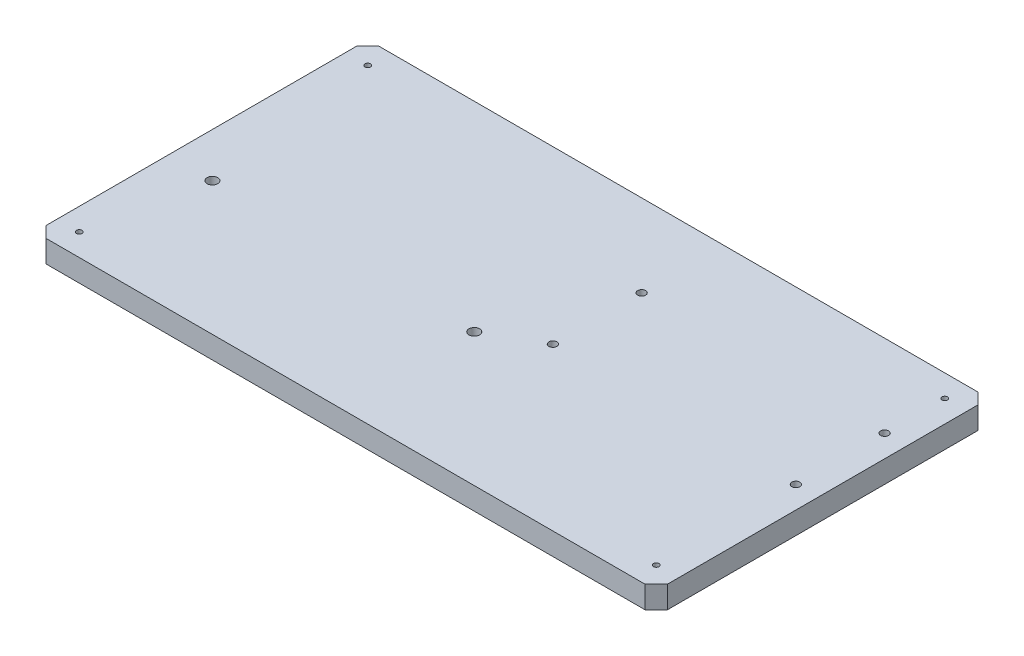
ISO-10303-21;
HEADER;
FILE_DESCRIPTION(('STEP AP214'),'2;1');
FILE_NAME('part.step','',(''),(''),'','','');
FILE_SCHEMA(('AUTOMOTIVE_DESIGN { 1 0 10303 214 1 1 1 1 }'));
ENDSEC;
DATA;
#1=APPLICATION_CONTEXT('core data for automotive mechanical design processes');
#2=APPLICATION_PROTOCOL_DEFINITION('international standard','automotive_design',2000,#1);
#3=PRODUCT_CONTEXT('',#1,'mechanical');
#4=PRODUCT('Part','Part','',(#3));
#5=PRODUCT_RELATED_PRODUCT_CATEGORY('part','',(#4));
#6=PRODUCT_DEFINITION_FORMATION('','',#4);
#7=PRODUCT_DEFINITION_CONTEXT('part definition',#1,'design');
#8=PRODUCT_DEFINITION('design','',#6,#7);
#9=PRODUCT_DEFINITION_SHAPE('','',#8);
#10=(LENGTH_UNIT() NAMED_UNIT(*) SI_UNIT(.MILLI.,.METRE.));
#11=(NAMED_UNIT(*) PLANE_ANGLE_UNIT() SI_UNIT($,.RADIAN.));
#12=(NAMED_UNIT(*) SI_UNIT($,.STERADIAN.) SOLID_ANGLE_UNIT());
#13=UNCERTAINTY_MEASURE_WITH_UNIT(LENGTH_MEASURE(1.E-05),#10,'distance_accuracy_value','');
#14=(GEOMETRIC_REPRESENTATION_CONTEXT(3) GLOBAL_UNCERTAINTY_ASSIGNED_CONTEXT((#13)) GLOBAL_UNIT_ASSIGNED_CONTEXT((#10,
#11,#12)) REPRESENTATION_CONTEXT('',''));
#15=CARTESIAN_POINT('',(0.,0.,0.));
#16=DIRECTION('',(0.,0.,1.));
#17=DIRECTION('',(1.,0.,0.));
#18=AXIS2_PLACEMENT_3D('',#15,#16,#17);
#19=CARTESIAN_POINT('',(0.,-10.,-5.));
#20=DIRECTION('',(-1.,0.,0.));
#21=DIRECTION('',(0.,0.,1.));
#22=AXIS2_PLACEMENT_3D('',#19,#20,#21);
#23=PLANE('',#22);
#24=DIRECTION('',(0.,0.,1.));
#25=VECTOR('',#24,1.);
#26=CARTESIAN_POINT('',(0.,0.,-5.));
#27=LINE('',#26,#25);
#28=CARTESIAN_POINT('',(0.,0.,-145.));
#29=VERTEX_POINT('',#28);
#30=CARTESIAN_POINT('',(0.,0.,-5.));
#31=VERTEX_POINT('',#30);
#32=EDGE_CURVE('E134',#29,#31,#27,.T.);
#33=ORIENTED_EDGE('',*,*,#32,.F.);
#34=DIRECTION('',(0.,1.,0.));
#35=VECTOR('',#34,1.);
#36=CARTESIAN_POINT('',(0.,-10.,-145.));
#37=LINE('',#36,#35);
#38=CARTESIAN_POINT('',(0.,-10.,-145.));
#39=VERTEX_POINT('',#38);
#40=EDGE_CURVE('E11',#39,#29,#37,.T.);
#41=ORIENTED_EDGE('',*,*,#40,.F.);
#42=DIRECTION('',(0.,0.,1.));
#43=VECTOR('',#42,1.);
#44=CARTESIAN_POINT('',(0.,-10.,-5.));
#45=LINE('',#44,#43);
#46=CARTESIAN_POINT('',(0.,-10.,-5.));
#47=VERTEX_POINT('',#46);
#48=EDGE_CURVE('E155',#39,#47,#45,.T.);
#49=ORIENTED_EDGE('',*,*,#48,.T.);
#50=DIRECTION('',(0.,1.,0.));
#51=VECTOR('',#50,1.);
#52=CARTESIAN_POINT('',(0.,-10.,-5.));
#53=LINE('',#52,#51);
#54=EDGE_CURVE('E40',#47,#31,#53,.T.);
#55=ORIENTED_EDGE('',*,*,#54,.T.);
#56=EDGE_LOOP('',(#33,#41,#49,#55));
#57=FACE_BOUND('',#56,.T.);
#58=ADVANCED_FACE('F37',(#57),#23,.T.);
#59=CARTESIAN_POINT('',(0.,-10.,-145.));
#60=DIRECTION('',(-0.707106781186548,0.,-0.707106781186547));
#61=DIRECTION('',(-0.707106781186547,0.,0.707106781186548));
#62=AXIS2_PLACEMENT_3D('',#59,#60,#61);
#63=PLANE('',#62);
#64=DIRECTION('',(-0.707106781186547,0.,0.707106781186548));
#65=VECTOR('',#64,1.);
#66=CARTESIAN_POINT('',(0.,0.,-145.));
#67=LINE('',#66,#65);
#68=CARTESIAN_POINT('',(5.,0.,-150.));
#69=VERTEX_POINT('',#68);
#70=EDGE_CURVE('E153',#69,#29,#67,.T.);
#71=ORIENTED_EDGE('',*,*,#70,.F.);
#72=DIRECTION('',(0.,1.,0.));
#73=VECTOR('',#72,1.);
#74=CARTESIAN_POINT('',(5.,-10.,-150.));
#75=LINE('',#74,#73);
#76=CARTESIAN_POINT('',(5.,-10.,-150.));
#77=VERTEX_POINT('',#76);
#78=EDGE_CURVE('E46',#77,#69,#75,.T.);
#79=ORIENTED_EDGE('',*,*,#78,.F.);
#80=DIRECTION('',(-0.707106781186547,0.,0.707106781186548));
#81=VECTOR('',#80,1.);
#82=CARTESIAN_POINT('',(0.,-10.,-145.));
#83=LINE('',#82,#81);
#84=EDGE_CURVE('E124',#77,#39,#83,.T.);
#85=ORIENTED_EDGE('',*,*,#84,.T.);
#86=ORIENTED_EDGE('',*,*,#40,.T.);
#87=EDGE_LOOP('',(#71,#79,#85,#86));
#88=FACE_BOUND('',#87,.T.);
#89=ADVANCED_FACE('F167',(#88),#63,.T.);
#90=CARTESIAN_POINT('',(5.,-10.,-150.));
#91=DIRECTION('',(0.,0.,-1.));
#92=DIRECTION('',(-1.,0.,0.));
#93=AXIS2_PLACEMENT_3D('',#90,#91,#92);
#94=PLANE('',#93);
#95=DIRECTION('',(-1.,0.,0.));
#96=VECTOR('',#95,1.);
#97=CARTESIAN_POINT('',(5.,0.,-150.));
#98=LINE('',#97,#96);
#99=CARTESIAN_POINT('',(275.,0.,-150.));
#100=VERTEX_POINT('',#99);
#101=EDGE_CURVE('E111',#100,#69,#98,.T.);
#102=ORIENTED_EDGE('',*,*,#101,.F.);
#103=DIRECTION('',(0.,1.,0.));
#104=VECTOR('',#103,1.);
#105=CARTESIAN_POINT('',(275.,-10.,-150.));
#106=LINE('',#105,#104);
#107=CARTESIAN_POINT('',(275.,-10.,-150.));
#108=VERTEX_POINT('',#107);
#109=EDGE_CURVE('E106',#108,#100,#106,.T.);
#110=ORIENTED_EDGE('',*,*,#109,.F.);
#111=DIRECTION('',(-1.,0.,0.));
#112=VECTOR('',#111,1.);
#113=CARTESIAN_POINT('',(5.,-10.,-150.));
#114=LINE('',#113,#112);
#115=EDGE_CURVE('E109',#108,#77,#114,.T.);
#116=ORIENTED_EDGE('',*,*,#115,.T.);
#117=ORIENTED_EDGE('',*,*,#78,.T.);
#118=EDGE_LOOP('',(#102,#110,#116,#117));
#119=FACE_BOUND('',#118,.T.);
#120=ADVANCED_FACE('F108',(#119),#94,.T.);
#121=CARTESIAN_POINT('',(275.,-10.,-150.));
#122=DIRECTION('',(0.707106781186548,0.,-0.707106781186548));
#123=DIRECTION('',(-0.707106781186548,0.,-0.707106781186548));
#124=AXIS2_PLACEMENT_3D('',#121,#122,#123);
#125=PLANE('',#124);
#126=DIRECTION('',(-0.707106781186547,0.,-0.707106781186547));
#127=VECTOR('',#126,1.);
#128=CARTESIAN_POINT('',(275.,0.,-150.));
#129=LINE('',#128,#127);
#130=CARTESIAN_POINT('',(280.,0.,-145.));
#131=VERTEX_POINT('',#130);
#132=EDGE_CURVE('E150',#131,#100,#129,.T.);
#133=ORIENTED_EDGE('',*,*,#132,.F.);
#134=DIRECTION('',(0.,1.,0.));
#135=VECTOR('',#134,1.);
#136=CARTESIAN_POINT('',(280.,-10.,-145.));
#137=LINE('',#136,#135);
#138=CARTESIAN_POINT('',(280.,-10.,-145.));
#139=VERTEX_POINT('',#138);
#140=EDGE_CURVE('E116',#139,#131,#137,.T.);
#141=ORIENTED_EDGE('',*,*,#140,.F.);
#142=DIRECTION('',(-0.707106781186547,0.,-0.707106781186547));
#143=VECTOR('',#142,1.);
#144=CARTESIAN_POINT('',(275.,-10.,-150.));
#145=LINE('',#144,#143);
#146=EDGE_CURVE('E122',#139,#108,#145,.T.);
#147=ORIENTED_EDGE('',*,*,#146,.T.);
#148=ORIENTED_EDGE('',*,*,#109,.T.);
#149=EDGE_LOOP('',(#133,#141,#147,#148));
#150=FACE_BOUND('',#149,.T.);
#151=ADVANCED_FACE('F126',(#150),#125,.T.);
#152=CARTESIAN_POINT('',(280.,-10.,-5.));
#153=DIRECTION('',(1.,0.,0.));
#154=DIRECTION('',(0.,0.,-1.));
#155=AXIS2_PLACEMENT_3D('',#152,#153,#154);
#156=PLANE('',#155);
#157=DIRECTION('',(0.,0.,-1.));
#158=VECTOR('',#157,1.);
#159=CARTESIAN_POINT('',(280.,0.,-5.));
#160=LINE('',#159,#158);
#161=CARTESIAN_POINT('',(280.,0.,-5.));
#162=VERTEX_POINT('',#161);
#163=EDGE_CURVE('E147',#162,#131,#160,.T.);
#164=ORIENTED_EDGE('',*,*,#163,.F.);
#165=DIRECTION('',(0.,1.,0.));
#166=VECTOR('',#165,1.);
#167=CARTESIAN_POINT('',(280.,-10.,-5.));
#168=LINE('',#167,#166);
#169=CARTESIAN_POINT('',(280.,-10.,-5.));
#170=VERTEX_POINT('',#169);
#171=EDGE_CURVE('E159',#170,#162,#168,.T.);
#172=ORIENTED_EDGE('',*,*,#171,.F.);
#173=DIRECTION('',(0.,0.,-1.));
#174=VECTOR('',#173,1.);
#175=CARTESIAN_POINT('',(280.,-10.,-5.));
#176=LINE('',#175,#174);
#177=EDGE_CURVE('E127',#170,#139,#176,.T.);
#178=ORIENTED_EDGE('',*,*,#177,.T.);
#179=ORIENTED_EDGE('',*,*,#140,.T.);
#180=EDGE_LOOP('',(#164,#172,#178,#179));
#181=FACE_BOUND('',#180,.T.);
#182=ADVANCED_FACE('F180',(#181),#156,.T.);
#183=CARTESIAN_POINT('',(275.,-10.,0.));
#184=DIRECTION('',(0.707106781186547,0.,0.707106781186548));
#185=DIRECTION('',(0.707106781186548,0.,-0.707106781186547));
#186=AXIS2_PLACEMENT_3D('',#183,#184,#185);
#187=PLANE('',#186);
#188=DIRECTION('',(0.707106781186548,0.,-0.707106781186547));
#189=VECTOR('',#188,1.);
#190=CARTESIAN_POINT('',(275.,0.,0.));
#191=LINE('',#190,#189);
#192=CARTESIAN_POINT('',(275.,0.,0.));
#193=VERTEX_POINT('',#192);
#194=EDGE_CURVE('E144',#193,#162,#191,.T.);
#195=ORIENTED_EDGE('',*,*,#194,.F.);
#196=DIRECTION('',(0.,1.,0.));
#197=VECTOR('',#196,1.);
#198=CARTESIAN_POINT('',(275.,-10.,0.));
#199=LINE('',#198,#197);
#200=CARTESIAN_POINT('',(275.,-10.,0.));
#201=VERTEX_POINT('',#200);
#202=EDGE_CURVE('E161',#201,#193,#199,.T.);
#203=ORIENTED_EDGE('',*,*,#202,.F.);
#204=DIRECTION('',(0.707106781186548,0.,-0.707106781186547));
#205=VECTOR('',#204,1.);
#206=CARTESIAN_POINT('',(275.,-10.,0.));
#207=LINE('',#206,#205);
#208=EDGE_CURVE('E129',#201,#170,#207,.T.);
#209=ORIENTED_EDGE('',*,*,#208,.T.);
#210=ORIENTED_EDGE('',*,*,#171,.T.);
#211=EDGE_LOOP('',(#195,#203,#209,#210));
#212=FACE_BOUND('',#211,.T.);
#213=ADVANCED_FACE('F183',(#212),#187,.T.);
#214=CARTESIAN_POINT('',(5.,-10.,0.));
#215=DIRECTION('',(0.,0.,1.));
#216=DIRECTION('',(1.,0.,0.));
#217=AXIS2_PLACEMENT_3D('',#214,#215,#216);
#218=PLANE('',#217);
#219=DIRECTION('',(1.,0.,0.));
#220=VECTOR('',#219,1.);
#221=CARTESIAN_POINT('',(5.,0.,0.));
#222=LINE('',#221,#220);
#223=CARTESIAN_POINT('',(5.,0.,0.));
#224=VERTEX_POINT('',#223);
#225=EDGE_CURVE('E141',#224,#193,#222,.T.);
#226=ORIENTED_EDGE('',*,*,#225,.F.);
#227=DIRECTION('',(0.,1.,0.));
#228=VECTOR('',#227,1.);
#229=CARTESIAN_POINT('',(5.,-10.,0.));
#230=LINE('',#229,#228);
#231=CARTESIAN_POINT('',(5.,-10.,0.));
#232=VERTEX_POINT('',#231);
#233=EDGE_CURVE('E162',#232,#224,#230,.T.);
#234=ORIENTED_EDGE('',*,*,#233,.F.);
#235=DIRECTION('',(1.,0.,0.));
#236=VECTOR('',#235,1.);
#237=CARTESIAN_POINT('',(5.,-10.,0.));
#238=LINE('',#237,#236);
#239=EDGE_CURVE('E393',#232,#201,#238,.T.);
#240=ORIENTED_EDGE('',*,*,#239,.T.);
#241=ORIENTED_EDGE('',*,*,#202,.T.);
#242=EDGE_LOOP('',(#226,#234,#240,#241));
#243=FACE_BOUND('',#242,.T.);
#244=ADVANCED_FACE('F187',(#243),#218,.T.);
#245=CARTESIAN_POINT('',(0.,-10.,-5.));
#246=DIRECTION('',(-0.707106781186548,0.,0.707106781186548));
#247=DIRECTION('',(0.707106781186548,0.,0.707106781186548));
#248=AXIS2_PLACEMENT_3D('',#245,#246,#247);
#249=PLANE('',#248);
#250=DIRECTION('',(0.707106781186548,0.,0.707106781186548));
#251=VECTOR('',#250,1.);
#252=CARTESIAN_POINT('',(0.,0.,-5.));
#253=LINE('',#252,#251);
#254=EDGE_CURVE('E137',#31,#224,#253,.T.);
#255=ORIENTED_EDGE('',*,*,#254,.F.);
#256=ORIENTED_EDGE('',*,*,#54,.F.);
#257=DIRECTION('',(0.707106781186548,0.,0.707106781186548));
#258=VECTOR('',#257,1.);
#259=CARTESIAN_POINT('',(0.,-10.,-5.));
#260=LINE('',#259,#258);
#261=EDGE_CURVE('E391',#47,#232,#260,.T.);
#262=ORIENTED_EDGE('',*,*,#261,.T.);
#263=ORIENTED_EDGE('',*,*,#233,.T.);
#264=EDGE_LOOP('',(#255,#256,#262,#263));
#265=FACE_BOUND('',#264,.T.);
#266=ADVANCED_FACE('F164',(#265),#249,.T.);
#267=CARTESIAN_POINT('',(0.,-10.,0.));
#268=DIRECTION('',(0.,-1.,0.));
#269=DIRECTION('',(0.,0.,-1.));
#270=AXIS2_PLACEMENT_3D('',#267,#268,#269);
#271=PLANE('',#270);
#272=CARTESIAN_POINT('',(160.5,-10.,-112.922675535204));
#273=DIRECTION('',(0.,-1.,0.));
#274=DIRECTION('',(0.,0.,-1.));
#275=AXIS2_PLACEMENT_3D('',#272,#273,#274);
#276=CIRCLE('',#275,3.5);
#277=CARTESIAN_POINT('',(160.5,-10.,-116.422675535204));
#278=VERTEX_POINT('',#277);
#279=EDGE_CURVE('E297',#278,#278,#276,.T.);
#280=ORIENTED_EDGE('',*,*,#279,.F.);
#281=EDGE_LOOP('',(#280));
#282=FACE_BOUND('',#281,.T.);
#283=CARTESIAN_POINT('',(160.5,-10.,-72.9226755352042));
#284=DIRECTION('',(0.,-1.,0.));
#285=DIRECTION('',(0.,0.,-1.));
#286=AXIS2_PLACEMENT_3D('',#283,#284,#285);
#287=CIRCLE('',#286,3.5);
#288=CARTESIAN_POINT('',(160.5,-10.,-76.4226755352042));
#289=VERTEX_POINT('',#288);
#290=EDGE_CURVE('E307',#289,#289,#287,.T.);
#291=ORIENTED_EDGE('',*,*,#290,.F.);
#292=EDGE_LOOP('',(#291));
#293=FACE_BOUND('',#292,.T.);
#294=CARTESIAN_POINT('',(270.,-10.,-112.922675535204));
#295=DIRECTION('',(0.,-1.,0.));
#296=DIRECTION('',(0.,0.,-1.));
#297=AXIS2_PLACEMENT_3D('',#294,#295,#296);
#298=CIRCLE('',#297,3.5);
#299=CARTESIAN_POINT('',(270.,-10.,-116.422675535204));
#300=VERTEX_POINT('',#299);
#301=EDGE_CURVE('E319',#300,#300,#298,.T.);
#302=ORIENTED_EDGE('',*,*,#301,.F.);
#303=EDGE_LOOP('',(#302));
#304=FACE_BOUND('',#303,.T.);
#305=CARTESIAN_POINT('',(270.,-10.,-72.9226755352042));
#306=DIRECTION('',(0.,-1.,0.));
#307=DIRECTION('',(0.,0.,-1.));
#308=AXIS2_PLACEMENT_3D('',#305,#306,#307);
#309=CIRCLE('',#308,3.5);
#310=CARTESIAN_POINT('',(270.,-10.,-76.4226755352042));
#311=VERTEX_POINT('',#310);
#312=EDGE_CURVE('E331',#311,#311,#309,.T.);
#313=ORIENTED_EDGE('',*,*,#312,.F.);
#314=EDGE_LOOP('',(#313));
#315=FACE_BOUND('',#314,.T.);
#316=CARTESIAN_POINT('',(10.,-10.,-10.));
#317=DIRECTION('',(0.,-1.,0.));
#318=DIRECTION('',(0.,0.,-1.));
#319=AXIS2_PLACEMENT_3D('',#316,#317,#318);
#320=CIRCLE('',#319,1.25);
#321=CARTESIAN_POINT('',(10.,-10.,-11.25));
#322=VERTEX_POINT('',#321);
#323=EDGE_CURVE('E343',#322,#322,#320,.T.);
#324=ORIENTED_EDGE('',*,*,#323,.F.);
#325=EDGE_LOOP('',(#324));
#326=FACE_BOUND('',#325,.T.);
#327=CARTESIAN_POINT('',(10.,-10.,-140.));
#328=DIRECTION('',(0.,-1.,0.));
#329=DIRECTION('',(0.,0.,-1.));
#330=AXIS2_PLACEMENT_3D('',#327,#328,#329);
#331=CIRCLE('',#330,1.25);
#332=CARTESIAN_POINT('',(10.,-10.,-141.25));
#333=VERTEX_POINT('',#332);
#334=EDGE_CURVE('E349',#333,#333,#331,.T.);
#335=ORIENTED_EDGE('',*,*,#334,.F.);
#336=EDGE_LOOP('',(#335));
#337=FACE_BOUND('',#336,.T.);
#338=CARTESIAN_POINT('',(270.,-10.,-140.));
#339=DIRECTION('',(0.,-1.,0.));
#340=DIRECTION('',(0.,0.,-1.));
#341=AXIS2_PLACEMENT_3D('',#338,#339,#340);
#342=CIRCLE('',#341,1.24999999999997);
#343=CARTESIAN_POINT('',(270.,-10.,-141.25));
#344=VERTEX_POINT('',#343);
#345=EDGE_CURVE('E355',#344,#344,#342,.T.);
#346=ORIENTED_EDGE('',*,*,#345,.F.);
#347=EDGE_LOOP('',(#346));
#348=FACE_BOUND('',#347,.T.);
#349=CARTESIAN_POINT('',(270.,-10.,-10.));
#350=DIRECTION('',(0.,-1.,0.));
#351=DIRECTION('',(0.,0.,-1.));
#352=AXIS2_PLACEMENT_3D('',#349,#350,#351);
#353=CIRCLE('',#352,1.24999999999997);
#354=CARTESIAN_POINT('',(270.,-10.,-11.25));
#355=VERTEX_POINT('',#354);
#356=EDGE_CURVE('E361',#355,#355,#353,.T.);
#357=ORIENTED_EDGE('',*,*,#356,.F.);
#358=EDGE_LOOP('',(#357));
#359=FACE_BOUND('',#358,.T.);
#360=CARTESIAN_POINT('',(138.,-10.,-60.));
#361=DIRECTION('',(0.,-1.,0.));
#362=DIRECTION('',(0.,0.,-1.));
#363=AXIS2_PLACEMENT_3D('',#360,#361,#362);
#364=CIRCLE('',#363,4.5);
#365=CARTESIAN_POINT('',(138.,-10.,-64.5));
#366=VERTEX_POINT('',#365);
#367=EDGE_CURVE('E367',#366,#366,#364,.T.);
#368=ORIENTED_EDGE('',*,*,#367,.F.);
#369=EDGE_LOOP('',(#368));
#370=FACE_BOUND('',#369,.T.);
#371=CARTESIAN_POINT('',(20.,-10.,-60.));
#372=DIRECTION('',(0.,-1.,0.));
#373=DIRECTION('',(0.,0.,-1.));
#374=AXIS2_PLACEMENT_3D('',#371,#372,#373);
#375=CIRCLE('',#374,4.49999999999999);
#376=CARTESIAN_POINT('',(20.,-10.,-64.5));
#377=VERTEX_POINT('',#376);
#378=EDGE_CURVE('E379',#377,#377,#375,.T.);
#379=ORIENTED_EDGE('',*,*,#378,.F.);
#380=EDGE_LOOP('',(#379));
#381=FACE_BOUND('',#380,.T.);
#382=ORIENTED_EDGE('',*,*,#48,.F.);
#383=ORIENTED_EDGE('',*,*,#84,.F.);
#384=ORIENTED_EDGE('',*,*,#115,.F.);
#385=ORIENTED_EDGE('',*,*,#146,.F.);
#386=ORIENTED_EDGE('',*,*,#177,.F.);
#387=ORIENTED_EDGE('',*,*,#208,.F.);
#388=ORIENTED_EDGE('',*,*,#239,.F.);
#389=ORIENTED_EDGE('',*,*,#261,.F.);
#390=EDGE_LOOP('',(#382,#383,#384,#385,#386,#387,#388,#389));
#391=FACE_BOUND('',#390,.T.);
#392=ADVANCED_FACE('F120',(#282,#293,#304,#315,#326,#337,#348,#359,#370,#381,#391),#271,.T.);
#393=CARTESIAN_POINT('',(0.,0.,0.));
#394=DIRECTION('',(0.,-1.,0.));
#395=DIRECTION('',(0.,0.,-1.));
#396=AXIS2_PLACEMENT_3D('',#393,#394,#395);
#397=PLANE('',#396);
#398=CARTESIAN_POINT('',(160.5,0.,-112.922675535204));
#399=DIRECTION('',(0.,-1.,0.));
#400=DIRECTION('',(0.,0.,-1.));
#401=AXIS2_PLACEMENT_3D('',#398,#399,#400);
#402=CIRCLE('',#401,1.8);
#403=CARTESIAN_POINT('',(160.5,0.,-114.722675535204));
#404=VERTEX_POINT('',#403);
#405=EDGE_CURVE('E304',#404,#404,#402,.T.);
#406=ORIENTED_EDGE('',*,*,#405,.T.);
#407=EDGE_LOOP('',(#406));
#408=FACE_BOUND('',#407,.T.);
#409=CARTESIAN_POINT('',(160.5,0.,-72.9226755352042));
#410=DIRECTION('',(0.,-1.,0.));
#411=DIRECTION('',(0.,0.,-1.));
#412=AXIS2_PLACEMENT_3D('',#409,#410,#411);
#413=CIRCLE('',#412,1.8);
#414=CARTESIAN_POINT('',(160.5,0.,-74.7226755352042));
#415=VERTEX_POINT('',#414);
#416=EDGE_CURVE('E316',#415,#415,#413,.T.);
#417=ORIENTED_EDGE('',*,*,#416,.T.);
#418=EDGE_LOOP('',(#417));
#419=FACE_BOUND('',#418,.T.);
#420=CARTESIAN_POINT('',(270.,0.,-112.922675535204));
#421=DIRECTION('',(0.,-1.,0.));
#422=DIRECTION('',(0.,0.,-1.));
#423=AXIS2_PLACEMENT_3D('',#420,#421,#422);
#424=CIRCLE('',#423,1.80000000000002);
#425=CARTESIAN_POINT('',(270.,0.,-114.722675535204));
#426=VERTEX_POINT('',#425);
#427=EDGE_CURVE('E328',#426,#426,#424,.T.);
#428=ORIENTED_EDGE('',*,*,#427,.T.);
#429=EDGE_LOOP('',(#428));
#430=FACE_BOUND('',#429,.T.);
#431=CARTESIAN_POINT('',(270.,0.,-72.9226755352042));
#432=DIRECTION('',(0.,-1.,0.));
#433=DIRECTION('',(0.,0.,-1.));
#434=AXIS2_PLACEMENT_3D('',#431,#432,#433);
#435=CIRCLE('',#434,1.80000000000002);
#436=CARTESIAN_POINT('',(270.,0.,-74.7226755352042));
#437=VERTEX_POINT('',#436);
#438=EDGE_CURVE('E340',#437,#437,#435,.T.);
#439=ORIENTED_EDGE('',*,*,#438,.T.);
#440=EDGE_LOOP('',(#439));
#441=FACE_BOUND('',#440,.T.);
#442=CARTESIAN_POINT('',(10.,0.,-10.));
#443=DIRECTION('',(0.,-1.,0.));
#444=DIRECTION('',(0.,0.,-1.));
#445=AXIS2_PLACEMENT_3D('',#442,#443,#444);
#446=CIRCLE('',#445,1.25);
#447=CARTESIAN_POINT('',(10.,0.,-11.25));
#448=VERTEX_POINT('',#447);
#449=EDGE_CURVE('E346',#448,#448,#446,.T.);
#450=ORIENTED_EDGE('',*,*,#449,.T.);
#451=EDGE_LOOP('',(#450));
#452=FACE_BOUND('',#451,.T.);
#453=CARTESIAN_POINT('',(10.,0.,-140.));
#454=DIRECTION('',(0.,-1.,0.));
#455=DIRECTION('',(0.,0.,-1.));
#456=AXIS2_PLACEMENT_3D('',#453,#454,#455);
#457=CIRCLE('',#456,1.25);
#458=CARTESIAN_POINT('',(10.,0.,-141.25));
#459=VERTEX_POINT('',#458);
#460=EDGE_CURVE('E352',#459,#459,#457,.T.);
#461=ORIENTED_EDGE('',*,*,#460,.T.);
#462=EDGE_LOOP('',(#461));
#463=FACE_BOUND('',#462,.T.);
#464=CARTESIAN_POINT('',(270.,0.,-140.));
#465=DIRECTION('',(0.,-1.,0.));
#466=DIRECTION('',(0.,0.,-1.));
#467=AXIS2_PLACEMENT_3D('',#464,#465,#466);
#468=CIRCLE('',#467,1.24999999999997);
#469=CARTESIAN_POINT('',(270.,0.,-141.25));
#470=VERTEX_POINT('',#469);
#471=EDGE_CURVE('E358',#470,#470,#468,.T.);
#472=ORIENTED_EDGE('',*,*,#471,.T.);
#473=EDGE_LOOP('',(#472));
#474=FACE_BOUND('',#473,.T.);
#475=CARTESIAN_POINT('',(270.,0.,-10.));
#476=DIRECTION('',(0.,-1.,0.));
#477=DIRECTION('',(0.,0.,-1.));
#478=AXIS2_PLACEMENT_3D('',#475,#476,#477);
#479=CIRCLE('',#478,1.24999999999997);
#480=CARTESIAN_POINT('',(270.,0.,-11.25));
#481=VERTEX_POINT('',#480);
#482=EDGE_CURVE('E364',#481,#481,#479,.T.);
#483=ORIENTED_EDGE('',*,*,#482,.T.);
#484=EDGE_LOOP('',(#483));
#485=FACE_BOUND('',#484,.T.);
#486=CARTESIAN_POINT('',(138.,0.,-60.));
#487=DIRECTION('',(0.,-1.,0.));
#488=DIRECTION('',(0.,0.,-1.));
#489=AXIS2_PLACEMENT_3D('',#486,#487,#488);
#490=CIRCLE('',#489,2.39999999999999);
#491=CARTESIAN_POINT('',(138.,0.,-62.4));
#492=VERTEX_POINT('',#491);
#493=EDGE_CURVE('E376',#492,#492,#490,.T.);
#494=ORIENTED_EDGE('',*,*,#493,.T.);
#495=EDGE_LOOP('',(#494));
#496=FACE_BOUND('',#495,.T.);
#497=CARTESIAN_POINT('',(20.,0.,-60.));
#498=DIRECTION('',(0.,-1.,0.));
#499=DIRECTION('',(0.,0.,-1.));
#500=AXIS2_PLACEMENT_3D('',#497,#498,#499);
#501=CIRCLE('',#500,2.4);
#502=CARTESIAN_POINT('',(20.,0.,-62.4));
#503=VERTEX_POINT('',#502);
#504=EDGE_CURVE('E138',#503,#503,#501,.T.);
#505=ORIENTED_EDGE('',*,*,#504,.T.);
#506=EDGE_LOOP('',(#505));
#507=FACE_BOUND('',#506,.T.);
#508=ORIENTED_EDGE('',*,*,#32,.T.);
#509=ORIENTED_EDGE('',*,*,#254,.T.);
#510=ORIENTED_EDGE('',*,*,#225,.T.);
#511=ORIENTED_EDGE('',*,*,#194,.T.);
#512=ORIENTED_EDGE('',*,*,#163,.T.);
#513=ORIENTED_EDGE('',*,*,#132,.T.);
#514=ORIENTED_EDGE('',*,*,#101,.T.);
#515=ORIENTED_EDGE('',*,*,#70,.T.);
#516=EDGE_LOOP('',(#508,#509,#510,#511,#512,#513,#514,#515));
#517=FACE_BOUND('',#516,.T.);
#518=ADVANCED_FACE('F166',(#408,#419,#430,#441,#452,#463,#474,#485,#496,#507,#517),#397,.F.);
#519=CARTESIAN_POINT('',(20.,-10.,-60.));
#520=DIRECTION('',(0.,-1.,0.));
#521=DIRECTION('',(0.,0.,-1.));
#522=AXIS2_PLACEMENT_3D('',#519,#520,#521);
#523=CYLINDRICAL_SURFACE('',#522,2.4);
#524=ORIENTED_EDGE('',*,*,#504,.F.);
#525=EDGE_LOOP('',(#524));
#526=FACE_BOUND('',#525,.T.);
#527=CARTESIAN_POINT('',(20.,-5.,-60.));
#528=DIRECTION('',(0.,-1.,0.));
#529=DIRECTION('',(0.,0.,-1.));
#530=AXIS2_PLACEMENT_3D('',#527,#528,#529);
#531=CIRCLE('',#530,2.4);
#532=CARTESIAN_POINT('',(20.,-5.,-62.4));
#533=VERTEX_POINT('',#532);
#534=EDGE_CURVE('E385',#533,#533,#531,.T.);
#535=ORIENTED_EDGE('',*,*,#534,.T.);
#536=EDGE_LOOP('',(#535));
#537=FACE_BOUND('',#536,.T.);
#538=ADVANCED_FACE('F199',(#526,#537),#523,.F.);
#539=CARTESIAN_POINT('',(22.4,-5.,-60.));
#540=DIRECTION('',(0.,1.,0.));
#541=DIRECTION('',(0.,0.,1.));
#542=AXIS2_PLACEMENT_3D('',#539,#540,#541);
#543=PLANE('',#542);
#544=ORIENTED_EDGE('',*,*,#534,.F.);
#545=EDGE_LOOP('',(#544));
#546=FACE_BOUND('',#545,.T.);
#547=CARTESIAN_POINT('',(20.,-5.,-60.));
#548=DIRECTION('',(0.,-1.,0.));
#549=DIRECTION('',(0.,0.,-1.));
#550=AXIS2_PLACEMENT_3D('',#547,#548,#549);
#551=CIRCLE('',#550,4.5);
#552=CARTESIAN_POINT('',(20.,-5.,-64.5));
#553=VERTEX_POINT('',#552);
#554=EDGE_CURVE('E382',#553,#553,#551,.T.);
#555=ORIENTED_EDGE('',*,*,#554,.T.);
#556=EDGE_LOOP('',(#555));
#557=FACE_BOUND('',#556,.T.);
#558=ADVANCED_FACE('F206',(#546,#557),#543,.F.);
#559=CARTESIAN_POINT('',(20.,-10.,-60.));
#560=DIRECTION('',(0.,-1.,0.));
#561=DIRECTION('',(0.,0.,-1.));
#562=AXIS2_PLACEMENT_3D('',#559,#560,#561);
#563=CYLINDRICAL_SURFACE('',#562,4.5);
#564=ORIENTED_EDGE('',*,*,#554,.F.);
#565=EDGE_LOOP('',(#564));
#566=FACE_BOUND('',#565,.T.);
#567=ORIENTED_EDGE('',*,*,#378,.T.);
#568=EDGE_LOOP('',(#567));
#569=FACE_BOUND('',#568,.T.);
#570=ADVANCED_FACE('F210',(#566,#569),#563,.F.);
#571=CARTESIAN_POINT('',(138.,-10.,-60.));
#572=DIRECTION('',(0.,-1.,0.));
#573=DIRECTION('',(0.,0.,-1.));
#574=AXIS2_PLACEMENT_3D('',#571,#572,#573);
#575=CYLINDRICAL_SURFACE('',#574,2.4);
#576=ORIENTED_EDGE('',*,*,#493,.F.);
#577=EDGE_LOOP('',(#576));
#578=FACE_BOUND('',#577,.T.);
#579=CARTESIAN_POINT('',(138.,-5.,-60.));
#580=DIRECTION('',(0.,-1.,0.));
#581=DIRECTION('',(0.,0.,-1.));
#582=AXIS2_PLACEMENT_3D('',#579,#580,#581);
#583=CIRCLE('',#582,2.40000000000001);
#584=CARTESIAN_POINT('',(138.,-5.,-62.4));
#585=VERTEX_POINT('',#584);
#586=EDGE_CURVE('E373',#585,#585,#583,.T.);
#587=ORIENTED_EDGE('',*,*,#586,.T.);
#588=EDGE_LOOP('',(#587));
#589=FACE_BOUND('',#588,.T.);
#590=ADVANCED_FACE('F214',(#578,#589),#575,.F.);
#591=CARTESIAN_POINT('',(140.4,-5.,-60.));
#592=DIRECTION('',(0.,1.,0.));
#593=DIRECTION('',(0.,0.,1.));
#594=AXIS2_PLACEMENT_3D('',#591,#592,#593);
#595=PLANE('',#594);
#596=ORIENTED_EDGE('',*,*,#586,.F.);
#597=EDGE_LOOP('',(#596));
#598=FACE_BOUND('',#597,.T.);
#599=CARTESIAN_POINT('',(138.,-5.,-60.));
#600=DIRECTION('',(0.,-1.,0.));
#601=DIRECTION('',(0.,0.,-1.));
#602=AXIS2_PLACEMENT_3D('',#599,#600,#601);
#603=CIRCLE('',#602,4.5);
#604=CARTESIAN_POINT('',(138.,-5.,-64.5));
#605=VERTEX_POINT('',#604);
#606=EDGE_CURVE('E370',#605,#605,#603,.T.);
#607=ORIENTED_EDGE('',*,*,#606,.T.);
#608=EDGE_LOOP('',(#607));
#609=FACE_BOUND('',#608,.T.);
#610=ADVANCED_FACE('F218',(#598,#609),#595,.F.);
#611=CARTESIAN_POINT('',(138.,-10.,-60.));
#612=DIRECTION('',(0.,-1.,0.));
#613=DIRECTION('',(0.,0.,-1.));
#614=AXIS2_PLACEMENT_3D('',#611,#612,#613);
#615=CYLINDRICAL_SURFACE('',#614,4.5);
#616=ORIENTED_EDGE('',*,*,#606,.F.);
#617=EDGE_LOOP('',(#616));
#618=FACE_BOUND('',#617,.T.);
#619=ORIENTED_EDGE('',*,*,#367,.T.);
#620=EDGE_LOOP('',(#619));
#621=FACE_BOUND('',#620,.T.);
#622=ADVANCED_FACE('F222',(#618,#621),#615,.F.);
#623=CARTESIAN_POINT('',(270.,-10.,-10.));
#624=DIRECTION('',(0.,-1.,0.));
#625=DIRECTION('',(0.,0.,-1.));
#626=AXIS2_PLACEMENT_3D('',#623,#624,#625);
#627=CYLINDRICAL_SURFACE('',#626,1.24999999999997);
#628=ORIENTED_EDGE('',*,*,#482,.F.);
#629=EDGE_LOOP('',(#628));
#630=FACE_BOUND('',#629,.T.);
#631=ORIENTED_EDGE('',*,*,#356,.T.);
#632=EDGE_LOOP('',(#631));
#633=FACE_BOUND('',#632,.T.);
#634=ADVANCED_FACE('F226',(#630,#633),#627,.F.);
#635=CARTESIAN_POINT('',(270.,-10.,-140.));
#636=DIRECTION('',(0.,-1.,0.));
#637=DIRECTION('',(0.,0.,-1.));
#638=AXIS2_PLACEMENT_3D('',#635,#636,#637);
#639=CYLINDRICAL_SURFACE('',#638,1.24999999999997);
#640=ORIENTED_EDGE('',*,*,#471,.F.);
#641=EDGE_LOOP('',(#640));
#642=FACE_BOUND('',#641,.T.);
#643=ORIENTED_EDGE('',*,*,#345,.T.);
#644=EDGE_LOOP('',(#643));
#645=FACE_BOUND('',#644,.T.);
#646=ADVANCED_FACE('F230',(#642,#645),#639,.F.);
#647=CARTESIAN_POINT('',(10.,-10.,-140.));
#648=DIRECTION('',(0.,-1.,0.));
#649=DIRECTION('',(0.,0.,-1.));
#650=AXIS2_PLACEMENT_3D('',#647,#648,#649);
#651=CYLINDRICAL_SURFACE('',#650,1.25);
#652=ORIENTED_EDGE('',*,*,#460,.F.);
#653=EDGE_LOOP('',(#652));
#654=FACE_BOUND('',#653,.T.);
#655=ORIENTED_EDGE('',*,*,#334,.T.);
#656=EDGE_LOOP('',(#655));
#657=FACE_BOUND('',#656,.T.);
#658=ADVANCED_FACE('F234',(#654,#657),#651,.F.);
#659=CARTESIAN_POINT('',(10.,-10.,-10.));
#660=DIRECTION('',(0.,-1.,0.));
#661=DIRECTION('',(0.,0.,-1.));
#662=AXIS2_PLACEMENT_3D('',#659,#660,#661);
#663=CYLINDRICAL_SURFACE('',#662,1.25);
#664=ORIENTED_EDGE('',*,*,#449,.F.);
#665=EDGE_LOOP('',(#664));
#666=FACE_BOUND('',#665,.T.);
#667=ORIENTED_EDGE('',*,*,#323,.T.);
#668=EDGE_LOOP('',(#667));
#669=FACE_BOUND('',#668,.T.);
#670=ADVANCED_FACE('F238',(#666,#669),#663,.F.);
#671=CARTESIAN_POINT('',(270.,-10.,-72.9226755352042));
#672=DIRECTION('',(0.,-1.,0.));
#673=DIRECTION('',(0.,0.,-1.));
#674=AXIS2_PLACEMENT_3D('',#671,#672,#673);
#675=CYLINDRICAL_SURFACE('',#674,1.80000000000002);
#676=ORIENTED_EDGE('',*,*,#438,.F.);
#677=EDGE_LOOP('',(#676));
#678=FACE_BOUND('',#677,.T.);
#679=CARTESIAN_POINT('',(270.,-5.,-72.9226755352042));
#680=DIRECTION('',(0.,-1.,0.));
#681=DIRECTION('',(0.,0.,-1.));
#682=AXIS2_PLACEMENT_3D('',#679,#680,#681);
#683=CIRCLE('',#682,1.80000000000002);
#684=CARTESIAN_POINT('',(270.,-5.,-74.7226755352042));
#685=VERTEX_POINT('',#684);
#686=EDGE_CURVE('E337',#685,#685,#683,.T.);
#687=ORIENTED_EDGE('',*,*,#686,.T.);
#688=EDGE_LOOP('',(#687));
#689=FACE_BOUND('',#688,.T.);
#690=ADVANCED_FACE('F242',(#678,#689),#675,.F.);
#691=CARTESIAN_POINT('',(271.8,-5.,-72.9226755352042));
#692=DIRECTION('',(0.,1.,0.));
#693=DIRECTION('',(0.,0.,1.));
#694=AXIS2_PLACEMENT_3D('',#691,#692,#693);
#695=PLANE('',#694);
#696=ORIENTED_EDGE('',*,*,#686,.F.);
#697=EDGE_LOOP('',(#696));
#698=FACE_BOUND('',#697,.T.);
#699=CARTESIAN_POINT('',(270.,-5.,-72.9226755352042));
#700=DIRECTION('',(0.,-1.,0.));
#701=DIRECTION('',(0.,0.,-1.));
#702=AXIS2_PLACEMENT_3D('',#699,#700,#701);
#703=CIRCLE('',#702,3.5);
#704=CARTESIAN_POINT('',(270.,-5.,-76.4226755352042));
#705=VERTEX_POINT('',#704);
#706=EDGE_CURVE('E334',#705,#705,#703,.T.);
#707=ORIENTED_EDGE('',*,*,#706,.T.);
#708=EDGE_LOOP('',(#707));
#709=FACE_BOUND('',#708,.T.);
#710=ADVANCED_FACE('F246',(#698,#709),#695,.F.);
#711=CARTESIAN_POINT('',(270.,-10.,-72.9226755352042));
#712=DIRECTION('',(0.,-1.,0.));
#713=DIRECTION('',(0.,0.,-1.));
#714=AXIS2_PLACEMENT_3D('',#711,#712,#713);
#715=CYLINDRICAL_SURFACE('',#714,3.5);
#716=ORIENTED_EDGE('',*,*,#706,.F.);
#717=EDGE_LOOP('',(#716));
#718=FACE_BOUND('',#717,.T.);
#719=ORIENTED_EDGE('',*,*,#312,.T.);
#720=EDGE_LOOP('',(#719));
#721=FACE_BOUND('',#720,.T.);
#722=ADVANCED_FACE('F250',(#718,#721),#715,.F.);
#723=CARTESIAN_POINT('',(270.,-10.,-112.922675535204));
#724=DIRECTION('',(0.,-1.,0.));
#725=DIRECTION('',(0.,0.,-1.));
#726=AXIS2_PLACEMENT_3D('',#723,#724,#725);
#727=CYLINDRICAL_SURFACE('',#726,1.80000000000002);
#728=ORIENTED_EDGE('',*,*,#427,.F.);
#729=EDGE_LOOP('',(#728));
#730=FACE_BOUND('',#729,.T.);
#731=CARTESIAN_POINT('',(270.,-5.,-112.922675535204));
#732=DIRECTION('',(0.,-1.,0.));
#733=DIRECTION('',(0.,0.,-1.));
#734=AXIS2_PLACEMENT_3D('',#731,#732,#733);
#735=CIRCLE('',#734,1.80000000000002);
#736=CARTESIAN_POINT('',(270.,-5.,-114.722675535204));
#737=VERTEX_POINT('',#736);
#738=EDGE_CURVE('E325',#737,#737,#735,.T.);
#739=ORIENTED_EDGE('',*,*,#738,.T.);
#740=EDGE_LOOP('',(#739));
#741=FACE_BOUND('',#740,.T.);
#742=ADVANCED_FACE('F254',(#730,#741),#727,.F.);
#743=CARTESIAN_POINT('',(271.8,-5.,-112.922675535204));
#744=DIRECTION('',(0.,1.,0.));
#745=DIRECTION('',(0.,0.,1.));
#746=AXIS2_PLACEMENT_3D('',#743,#744,#745);
#747=PLANE('',#746);
#748=ORIENTED_EDGE('',*,*,#738,.F.);
#749=EDGE_LOOP('',(#748));
#750=FACE_BOUND('',#749,.T.);
#751=CARTESIAN_POINT('',(270.,-5.,-112.922675535204));
#752=DIRECTION('',(0.,-1.,0.));
#753=DIRECTION('',(0.,0.,-1.));
#754=AXIS2_PLACEMENT_3D('',#751,#752,#753);
#755=CIRCLE('',#754,3.5);
#756=CARTESIAN_POINT('',(270.,-5.,-116.422675535204));
#757=VERTEX_POINT('',#756);
#758=EDGE_CURVE('E322',#757,#757,#755,.T.);
#759=ORIENTED_EDGE('',*,*,#758,.T.);
#760=EDGE_LOOP('',(#759));
#761=FACE_BOUND('',#760,.T.);
#762=ADVANCED_FACE('F258',(#750,#761),#747,.F.);
#763=CARTESIAN_POINT('',(270.,-10.,-112.922675535204));
#764=DIRECTION('',(0.,-1.,0.));
#765=DIRECTION('',(0.,0.,-1.));
#766=AXIS2_PLACEMENT_3D('',#763,#764,#765);
#767=CYLINDRICAL_SURFACE('',#766,3.5);
#768=ORIENTED_EDGE('',*,*,#758,.F.);
#769=EDGE_LOOP('',(#768));
#770=FACE_BOUND('',#769,.T.);
#771=ORIENTED_EDGE('',*,*,#301,.T.);
#772=EDGE_LOOP('',(#771));
#773=FACE_BOUND('',#772,.T.);
#774=ADVANCED_FACE('F262',(#770,#773),#767,.F.);
#775=CARTESIAN_POINT('',(160.5,-10.,-72.9226755352042));
#776=DIRECTION('',(0.,-1.,0.));
#777=DIRECTION('',(0.,0.,-1.));
#778=AXIS2_PLACEMENT_3D('',#775,#776,#777);
#779=CYLINDRICAL_SURFACE('',#778,1.8);
#780=ORIENTED_EDGE('',*,*,#416,.F.);
#781=EDGE_LOOP('',(#780));
#782=FACE_BOUND('',#781,.T.);
#783=CARTESIAN_POINT('',(160.5,-5.,-72.9226755352042));
#784=DIRECTION('',(0.,-1.,0.));
#785=DIRECTION('',(0.,0.,-1.));
#786=AXIS2_PLACEMENT_3D('',#783,#784,#785);
#787=CIRCLE('',#786,1.8);
#788=CARTESIAN_POINT('',(160.5,-5.,-74.7226755352042));
#789=VERTEX_POINT('',#788);
#790=EDGE_CURVE('E313',#789,#789,#787,.T.);
#791=ORIENTED_EDGE('',*,*,#790,.T.);
#792=EDGE_LOOP('',(#791));
#793=FACE_BOUND('',#792,.T.);
#794=ADVANCED_FACE('F266',(#782,#793),#779,.F.);
#795=CARTESIAN_POINT('',(162.3,-5.,-72.9226755352042));
#796=DIRECTION('',(0.,1.,0.));
#797=DIRECTION('',(0.,0.,1.));
#798=AXIS2_PLACEMENT_3D('',#795,#796,#797);
#799=PLANE('',#798);
#800=ORIENTED_EDGE('',*,*,#790,.F.);
#801=EDGE_LOOP('',(#800));
#802=FACE_BOUND('',#801,.T.);
#803=CARTESIAN_POINT('',(160.5,-5.,-72.9226755352042));
#804=DIRECTION('',(0.,-1.,0.));
#805=DIRECTION('',(0.,0.,-1.));
#806=AXIS2_PLACEMENT_3D('',#803,#804,#805);
#807=CIRCLE('',#806,3.5);
#808=CARTESIAN_POINT('',(160.5,-5.,-76.4226755352042));
#809=VERTEX_POINT('',#808);
#810=EDGE_CURVE('E310',#809,#809,#807,.T.);
#811=ORIENTED_EDGE('',*,*,#810,.T.);
#812=EDGE_LOOP('',(#811));
#813=FACE_BOUND('',#812,.T.);
#814=ADVANCED_FACE('F270',(#802,#813),#799,.F.);
#815=CARTESIAN_POINT('',(160.5,-10.,-72.9226755352042));
#816=DIRECTION('',(0.,-1.,0.));
#817=DIRECTION('',(0.,0.,-1.));
#818=AXIS2_PLACEMENT_3D('',#815,#816,#817);
#819=CYLINDRICAL_SURFACE('',#818,3.5);
#820=ORIENTED_EDGE('',*,*,#810,.F.);
#821=EDGE_LOOP('',(#820));
#822=FACE_BOUND('',#821,.T.);
#823=ORIENTED_EDGE('',*,*,#290,.T.);
#824=EDGE_LOOP('',(#823));
#825=FACE_BOUND('',#824,.T.);
#826=ADVANCED_FACE('F274',(#822,#825),#819,.F.);
#827=CARTESIAN_POINT('',(160.5,-10.,-112.922675535204));
#828=DIRECTION('',(0.,-1.,0.));
#829=DIRECTION('',(0.,0.,-1.));
#830=AXIS2_PLACEMENT_3D('',#827,#828,#829);
#831=CYLINDRICAL_SURFACE('',#830,1.8);
#832=ORIENTED_EDGE('',*,*,#405,.F.);
#833=EDGE_LOOP('',(#832));
#834=FACE_BOUND('',#833,.T.);
#835=CARTESIAN_POINT('',(160.5,-5.,-112.922675535204));
#836=DIRECTION('',(0.,-1.,0.));
#837=DIRECTION('',(0.,0.,-1.));
#838=AXIS2_PLACEMENT_3D('',#835,#836,#837);
#839=CIRCLE('',#838,1.8);
#840=CARTESIAN_POINT('',(160.5,-5.,-114.722675535204));
#841=VERTEX_POINT('',#840);
#842=EDGE_CURVE('E299',#841,#841,#839,.T.);
#843=ORIENTED_EDGE('',*,*,#842,.T.);
#844=EDGE_LOOP('',(#843));
#845=FACE_BOUND('',#844,.T.);
#846=ADVANCED_FACE('F278',(#834,#845),#831,.F.);
#847=CARTESIAN_POINT('',(162.3,-5.,-112.922675535204));
#848=DIRECTION('',(0.,1.,0.));
#849=DIRECTION('',(0.,0.,1.));
#850=AXIS2_PLACEMENT_3D('',#847,#848,#849);
#851=PLANE('',#850);
#852=ORIENTED_EDGE('',*,*,#842,.F.);
#853=EDGE_LOOP('',(#852));
#854=FACE_BOUND('',#853,.T.);
#855=CARTESIAN_POINT('',(160.5,-5.,-112.922675535204));
#856=DIRECTION('',(0.,-1.,0.));
#857=DIRECTION('',(0.,0.,-1.));
#858=AXIS2_PLACEMENT_3D('',#855,#856,#857);
#859=CIRCLE('',#858,3.5);
#860=CARTESIAN_POINT('',(160.5,-5.,-116.422675535204));
#861=VERTEX_POINT('',#860);
#862=EDGE_CURVE('E295',#861,#861,#859,.T.);
#863=ORIENTED_EDGE('',*,*,#862,.T.);
#864=EDGE_LOOP('',(#863));
#865=FACE_BOUND('',#864,.T.);
#866=ADVANCED_FACE('F282',(#854,#865),#851,.F.);
#867=CARTESIAN_POINT('',(160.5,-10.,-112.922675535204));
#868=DIRECTION('',(0.,-1.,0.));
#869=DIRECTION('',(0.,0.,-1.));
#870=AXIS2_PLACEMENT_3D('',#867,#868,#869);
#871=CYLINDRICAL_SURFACE('',#870,3.5);
#872=ORIENTED_EDGE('',*,*,#862,.F.);
#873=EDGE_LOOP('',(#872));
#874=FACE_BOUND('',#873,.T.);
#875=ORIENTED_EDGE('',*,*,#279,.T.);
#876=EDGE_LOOP('',(#875));
#877=FACE_BOUND('',#876,.T.);
#878=ADVANCED_FACE('F286',(#874,#877),#871,.F.);
#879=CLOSED_SHELL('',(#58,#89,#120,#151,#182,#213,#244,#266,#392,#518,#538,#558,#570,#590,#610,
#622,#634,#646,#658,#670,#690,#710,#722,#742,#762,#774,#794,#814,#826,#846,#866,#878));
#880=MANIFOLD_SOLID_BREP('B2',#879);
#881=ADVANCED_BREP_SHAPE_REPRESENTATION('',(#18,#880),#14);
#882=SHAPE_DEFINITION_REPRESENTATION(#9,#881);
ENDSEC;
END-ISO-10303-21;
